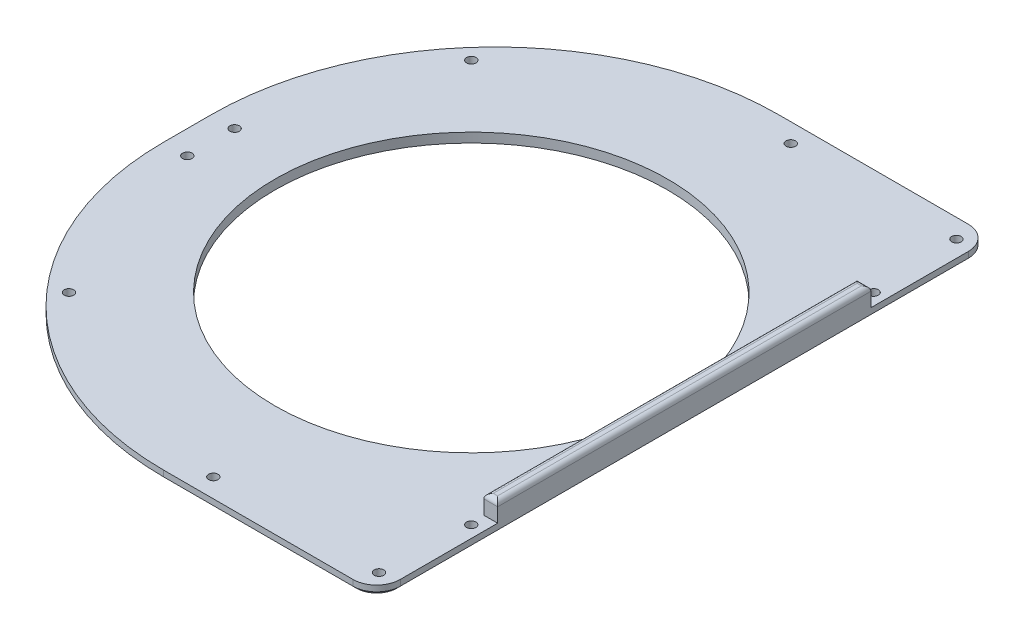
ISO-10303-21;
HEADER;
FILE_DESCRIPTION(('STEP AP214'),'2;1');
FILE_NAME('part.step','',(''),(''),'','','');
FILE_SCHEMA(('AUTOMOTIVE_DESIGN { 1 0 10303 214 1 1 1 1 }'));
ENDSEC;
DATA;
#1=APPLICATION_CONTEXT('core data for automotive mechanical design processes');
#2=APPLICATION_PROTOCOL_DEFINITION('international standard','automotive_design',2000,#1);
#3=PRODUCT_CONTEXT('',#1,'mechanical');
#4=PRODUCT('Part','Part','',(#3));
#5=PRODUCT_RELATED_PRODUCT_CATEGORY('part','',(#4));
#6=PRODUCT_DEFINITION_FORMATION('','',#4);
#7=PRODUCT_DEFINITION_CONTEXT('part definition',#1,'design');
#8=PRODUCT_DEFINITION('design','',#6,#7);
#9=PRODUCT_DEFINITION_SHAPE('','',#8);
#10=(LENGTH_UNIT() NAMED_UNIT(*) SI_UNIT(.MILLI.,.METRE.));
#11=(NAMED_UNIT(*) PLANE_ANGLE_UNIT() SI_UNIT($,.RADIAN.));
#12=(NAMED_UNIT(*) SI_UNIT($,.STERADIAN.) SOLID_ANGLE_UNIT());
#13=UNCERTAINTY_MEASURE_WITH_UNIT(LENGTH_MEASURE(1.E-05),#10,'distance_accuracy_value','');
#14=(GEOMETRIC_REPRESENTATION_CONTEXT(3) GLOBAL_UNCERTAINTY_ASSIGNED_CONTEXT((#13)) GLOBAL_UNIT_ASSIGNED_CONTEXT((#10,
#11,#12)) REPRESENTATION_CONTEXT('',''));
#15=CARTESIAN_POINT('',(0.,0.,0.));
#16=DIRECTION('',(0.,0.,1.));
#17=DIRECTION('',(1.,0.,0.));
#18=AXIS2_PLACEMENT_3D('',#15,#16,#17);
#19=CARTESIAN_POINT('',(0.,4.,0.));
#20=DIRECTION('',(0.,-1.,0.));
#21=DIRECTION('',(0.,0.,-1.));
#22=AXIS2_PLACEMENT_3D('',#19,#20,#21);
#23=PLANE('',#22);
#24=CARTESIAN_POINT('',(83.,4.,-122.));
#25=DIRECTION('',(0.,1.,0.));
#26=DIRECTION('',(0.,0.,1.));
#27=AXIS2_PLACEMENT_3D('',#24,#25,#26);
#28=CIRCLE('',#27,2.);
#29=CARTESIAN_POINT('',(83.,4.,-120.));
#30=VERTEX_POINT('',#29);
#31=EDGE_CURVE('E283',#30,#30,#28,.T.);
#32=ORIENTED_EDGE('',*,*,#31,.F.);
#33=EDGE_LOOP('',(#32));
#34=FACE_BOUND('',#33,.T.);
#35=CARTESIAN_POINT('',(85.,4.,85.));
#36=DIRECTION('',(0.,1.,0.));
#37=DIRECTION('',(0.,0.,1.));
#38=AXIS2_PLACEMENT_3D('',#35,#36,#37);
#39=CIRCLE('',#38,2.);
#40=CARTESIAN_POINT('',(85.,4.,87.));
#41=VERTEX_POINT('',#40);
#42=EDGE_CURVE('E221',#41,#41,#39,.T.);
#43=ORIENTED_EDGE('',*,*,#42,.F.);
#44=EDGE_LOOP('',(#43));
#45=FACE_BOUND('',#44,.T.);
#46=CARTESIAN_POINT('',(-110.,4.,-10.));
#47=DIRECTION('',(0.,1.,0.));
#48=DIRECTION('',(0.,0.,1.));
#49=AXIS2_PLACEMENT_3D('',#46,#47,#48);
#50=CIRCLE('',#49,2.);
#51=CARTESIAN_POINT('',(-110.,4.,-8.));
#52=VERTEX_POINT('',#51);
#53=EDGE_CURVE('E251',#52,#52,#50,.T.);
#54=ORIENTED_EDGE('',*,*,#53,.F.);
#55=EDGE_LOOP('',(#54));
#56=FACE_BOUND('',#55,.T.);
#57=CARTESIAN_POINT('',(13.,4.,122.));
#58=DIRECTION('',(0.,1.,0.));
#59=DIRECTION('',(0.,0.,-1.));
#60=AXIS2_PLACEMENT_3D('',#57,#58,#59);
#61=CIRCLE('',#60,2.);
#62=CARTESIAN_POINT('',(13.,4.,120.));
#63=VERTEX_POINT('',#62);
#64=EDGE_CURVE('E268',#63,#63,#61,.T.);
#65=ORIENTED_EDGE('',*,*,#64,.F.);
#66=EDGE_LOOP('',(#65));
#67=FACE_BOUND('',#66,.T.);
#68=CARTESIAN_POINT('',(83.,4.,122.));
#69=DIRECTION('',(0.,1.,0.));
#70=DIRECTION('',(0.,0.,-1.));
#71=AXIS2_PLACEMENT_3D('',#68,#69,#70);
#72=CIRCLE('',#71,2.);
#73=CARTESIAN_POINT('',(83.,4.,120.));
#74=VERTEX_POINT('',#73);
#75=EDGE_CURVE('E267',#74,#74,#72,.T.);
#76=ORIENTED_EDGE('',*,*,#75,.F.);
#77=EDGE_LOOP('',(#76));
#78=FACE_BOUND('',#77,.T.);
#79=CARTESIAN_POINT('',(13.,4.,-122.));
#80=DIRECTION('',(0.,1.,0.));
#81=DIRECTION('',(0.,0.,1.));
#82=AXIS2_PLACEMENT_3D('',#79,#80,#81);
#83=CIRCLE('',#82,2.);
#84=CARTESIAN_POINT('',(13.,4.,-120.));
#85=VERTEX_POINT('',#84);
#86=EDGE_CURVE('E284',#85,#85,#83,.T.);
#87=ORIENTED_EDGE('',*,*,#86,.F.);
#88=EDGE_LOOP('',(#87));
#89=FACE_BOUND('',#88,.T.);
#90=CARTESIAN_POINT('',(-85.,4.,85.));
#91=DIRECTION('',(0.,1.,0.));
#92=DIRECTION('',(0.,0.,1.));
#93=AXIS2_PLACEMENT_3D('',#90,#91,#92);
#94=CIRCLE('',#93,2.);
#95=CARTESIAN_POINT('',(-85.,4.,87.));
#96=VERTEX_POINT('',#95);
#97=EDGE_CURVE('E227',#96,#96,#94,.T.);
#98=ORIENTED_EDGE('',*,*,#97,.F.);
#99=EDGE_LOOP('',(#98));
#100=FACE_BOUND('',#99,.T.);
#101=CARTESIAN_POINT('',(85.,4.,-85.));
#102=DIRECTION('',(0.,1.,0.));
#103=DIRECTION('',(0.,0.,1.));
#104=AXIS2_PLACEMENT_3D('',#101,#102,#103);
#105=CIRCLE('',#104,2.);
#106=CARTESIAN_POINT('',(85.,4.,-83.));
#107=VERTEX_POINT('',#106);
#108=EDGE_CURVE('E236',#107,#107,#105,.T.);
#109=ORIENTED_EDGE('',*,*,#108,.F.);
#110=EDGE_LOOP('',(#109));
#111=FACE_BOUND('',#110,.T.);
#112=CARTESIAN_POINT('',(-85.,4.,-85.));
#113=DIRECTION('',(0.,1.,0.));
#114=DIRECTION('',(0.,0.,1.));
#115=AXIS2_PLACEMENT_3D('',#112,#113,#114);
#116=CIRCLE('',#115,2.);
#117=CARTESIAN_POINT('',(-85.,4.,-83.));
#118=VERTEX_POINT('',#117);
#119=EDGE_CURVE('E235',#118,#118,#116,.T.);
#120=ORIENTED_EDGE('',*,*,#119,.F.);
#121=EDGE_LOOP('',(#120));
#122=FACE_BOUND('',#121,.T.);
#123=CARTESIAN_POINT('',(-110.,4.,10.));
#124=DIRECTION('',(0.,1.,0.));
#125=DIRECTION('',(0.,0.,1.));
#126=AXIS2_PLACEMENT_3D('',#123,#124,#125);
#127=CIRCLE('',#126,2.);
#128=CARTESIAN_POINT('',(-110.,4.,12.));
#129=VERTEX_POINT('',#128);
#130=EDGE_CURVE('E252',#129,#129,#127,.T.);
#131=ORIENTED_EDGE('',*,*,#130,.F.);
#132=EDGE_LOOP('',(#131));
#133=FACE_BOUND('',#132,.T.);
#134=CARTESIAN_POINT('',(0.,4.,0.));
#135=DIRECTION('',(0.,1.,0.));
#136=DIRECTION('',(0.,0.,1.));
#137=AXIS2_PLACEMENT_3D('',#134,#135,#136);
#138=CIRCLE('',#137,83.);
#139=CARTESIAN_POINT('',(0.,4.,83.));
#140=VERTEX_POINT('',#139);
#141=EDGE_CURVE('E213',#140,#140,#138,.T.);
#142=ORIENTED_EDGE('',*,*,#141,.F.);
#143=EDGE_LOOP('',(#142));
#144=FACE_BOUND('',#143,.T.);
#145=DIRECTION('',(1.,0.,0.));
#146=VECTOR('',#145,1.);
#147=CARTESIAN_POINT('',(84.157247853746,4.,78.8649064876973));
#148=LINE('',#147,#146);
#149=CARTESIAN_POINT('',(84.157247853746,4.,78.8649064876973));
#150=VERTEX_POINT('',#149);
#151=CARTESIAN_POINT('',(90.,4.,78.8649064876973));
#152=VERTEX_POINT('',#151);
#153=EDGE_CURVE('E191',#150,#152,#148,.T.);
#154=ORIENTED_EDGE('',*,*,#153,.F.);
#155=DIRECTION('',(0.,0.,1.));
#156=VECTOR('',#155,1.);
#157=CARTESIAN_POINT('',(84.157247853746,4.,78.8649064876973));
#158=LINE('',#157,#156);
#159=CARTESIAN_POINT('',(84.157247853746,4.,-78.8649064876973));
#160=VERTEX_POINT('',#159);
#161=EDGE_CURVE('E173',#160,#150,#158,.T.);
#162=ORIENTED_EDGE('',*,*,#161,.F.);
#163=DIRECTION('',(-1.,0.,0.));
#164=VECTOR('',#163,1.);
#165=CARTESIAN_POINT('',(84.157247853746,4.,-78.8649064876973));
#166=LINE('',#165,#164);
#167=CARTESIAN_POINT('',(90.,4.,-78.8649064876973));
#168=VERTEX_POINT('',#167);
#169=EDGE_CURVE('E187',#168,#160,#166,.T.);
#170=ORIENTED_EDGE('',*,*,#169,.F.);
#171=DIRECTION('',(0.,0.,1.));
#172=VECTOR('',#171,1.);
#173=CARTESIAN_POINT('',(90.,4.,-130.));
#174=LINE('',#173,#172);
#175=CARTESIAN_POINT('',(90.,4.,-120.));
#176=VERTEX_POINT('',#175);
#177=EDGE_CURVE('E218',#176,#168,#174,.T.);
#178=ORIENTED_EDGE('',*,*,#177,.F.);
#179=CARTESIAN_POINT('',(80.,4.,-120.));
#180=DIRECTION('',(0.,-1.,0.));
#181=DIRECTION('',(0.,0.,-1.));
#182=AXIS2_PLACEMENT_3D('',#179,#180,#181);
#183=CIRCLE('',#182,10.);
#184=CARTESIAN_POINT('',(80.,4.,-130.));
#185=VERTEX_POINT('',#184);
#186=EDGE_CURVE('E324',#176,#185,#183,.F.);
#187=ORIENTED_EDGE('',*,*,#186,.T.);
#188=DIRECTION('',(-1.,0.,0.));
#189=VECTOR('',#188,1.);
#190=CARTESIAN_POINT('',(-120.,4.,-130.));
#191=LINE('',#190,#189);
#192=CARTESIAN_POINT('',(0.,4.,-130.));
#193=VERTEX_POINT('',#192);
#194=EDGE_CURVE('E299',#185,#193,#191,.T.);
#195=ORIENTED_EDGE('',*,*,#194,.T.);
#196=CARTESIAN_POINT('',(0.,4.,-10.));
#197=DIRECTION('',(0.,-1.,0.));
#198=DIRECTION('',(0.,0.,-1.));
#199=AXIS2_PLACEMENT_3D('',#196,#197,#198);
#200=CIRCLE('',#199,120.);
#201=CARTESIAN_POINT('',(-120.,4.,-10.));
#202=VERTEX_POINT('',#201);
#203=EDGE_CURVE('E347',#193,#202,#200,.F.);
#204=ORIENTED_EDGE('',*,*,#203,.T.);
#205=DIRECTION('',(0.,0.,1.));
#206=VECTOR('',#205,1.);
#207=CARTESIAN_POINT('',(-120.,4.,130.));
#208=LINE('',#207,#206);
#209=CARTESIAN_POINT('',(-120.,4.,10.));
#210=VERTEX_POINT('',#209);
#211=EDGE_CURVE('E306',#202,#210,#208,.T.);
#212=ORIENTED_EDGE('',*,*,#211,.T.);
#213=CARTESIAN_POINT('',(0.,4.,10.));
#214=DIRECTION('',(0.,-1.,0.));
#215=DIRECTION('',(0.,0.,-1.));
#216=AXIS2_PLACEMENT_3D('',#213,#214,#215);
#217=CIRCLE('',#216,120.);
#218=CARTESIAN_POINT('',(0.,4.,130.));
#219=VERTEX_POINT('',#218);
#220=EDGE_CURVE('E344',#210,#219,#217,.F.);
#221=ORIENTED_EDGE('',*,*,#220,.T.);
#222=DIRECTION('',(1.,0.,0.));
#223=VECTOR('',#222,1.);
#224=CARTESIAN_POINT('',(-120.,4.,130.));
#225=LINE('',#224,#223);
#226=CARTESIAN_POINT('',(80.,4.,130.));
#227=VERTEX_POINT('',#226);
#228=EDGE_CURVE('E310',#219,#227,#225,.T.);
#229=ORIENTED_EDGE('',*,*,#228,.T.);
#230=CARTESIAN_POINT('',(80.,4.,120.));
#231=DIRECTION('',(0.,-1.,0.));
#232=DIRECTION('',(0.,0.,-1.));
#233=AXIS2_PLACEMENT_3D('',#230,#231,#232);
#234=CIRCLE('',#233,10.);
#235=CARTESIAN_POINT('',(90.,4.,120.));
#236=VERTEX_POINT('',#235);
#237=EDGE_CURVE('E320',#227,#236,#234,.F.);
#238=ORIENTED_EDGE('',*,*,#237,.T.);
#239=EDGE_CURVE('E222',#152,#236,#174,.T.);
#240=ORIENTED_EDGE('',*,*,#239,.F.);
#241=EDGE_LOOP('',(#154,#162,#170,#178,#187,#195,#204,#212,#221,#229,#238,#240));
#242=FACE_BOUND('',#241,.T.);
#243=ADVANCED_FACE('F40',(#34,#45,#56,#67,#78,#89,#100,#111,#122,#133,#144,#242),#23,.F.);
#244=CARTESIAN_POINT('',(-120.,4.,-130.));
#245=DIRECTION('',(0.,0.,1.));
#246=DIRECTION('',(1.,0.,0.));
#247=AXIS2_PLACEMENT_3D('',#244,#245,#246);
#248=PLANE('',#247);
#249=DIRECTION('',(0.,1.,0.));
#250=VECTOR('',#249,1.);
#251=CARTESIAN_POINT('',(80.,4.,-130.));
#252=LINE('',#251,#250);
#253=CARTESIAN_POINT('',(80.,1.5,-130.));
#254=VERTEX_POINT('',#253);
#255=EDGE_CURVE('E327',#185,#254,#252,.F.);
#256=ORIENTED_EDGE('',*,*,#255,.T.);
#257=DIRECTION('',(-1.,0.,0.));
#258=VECTOR('',#257,1.);
#259=CARTESIAN_POINT('',(0.,1.5,-130.));
#260=LINE('',#259,#258);
#261=CARTESIAN_POINT('',(0.,1.5,-130.));
#262=VERTEX_POINT('',#261);
#263=EDGE_CURVE('E429',#254,#262,#260,.T.);
#264=ORIENTED_EDGE('',*,*,#263,.T.);
#265=DIRECTION('',(0.,-1.,0.));
#266=VECTOR('',#265,1.);
#267=CARTESIAN_POINT('',(0.,4.,-130.));
#268=LINE('',#267,#266);
#269=EDGE_CURVE('E341',#262,#193,#268,.F.);
#270=ORIENTED_EDGE('',*,*,#269,.T.);
#271=ORIENTED_EDGE('',*,*,#194,.F.);
#272=EDGE_LOOP('',(#256,#264,#270,#271));
#273=FACE_BOUND('',#272,.T.);
#274=ADVANCED_FACE('F526',(#273),#248,.F.);
#275=CARTESIAN_POINT('',(-120.,4.,130.));
#276=DIRECTION('',(1.,0.,0.));
#277=DIRECTION('',(0.,0.,-1.));
#278=AXIS2_PLACEMENT_3D('',#275,#276,#277);
#279=PLANE('',#278);
#280=DIRECTION('',(0.,-1.,0.));
#281=VECTOR('',#280,1.);
#282=CARTESIAN_POINT('',(-120.,4.,-10.));
#283=LINE('',#282,#281);
#284=CARTESIAN_POINT('',(-120.,1.5,-10.));
#285=VERTEX_POINT('',#284);
#286=EDGE_CURVE('E337',#202,#285,#283,.T.);
#287=ORIENTED_EDGE('',*,*,#286,.T.);
#288=DIRECTION('',(0.,0.,1.));
#289=VECTOR('',#288,1.);
#290=CARTESIAN_POINT('',(-120.,1.5,10.));
#291=LINE('',#290,#289);
#292=CARTESIAN_POINT('',(-120.,1.5,10.));
#293=VERTEX_POINT('',#292);
#294=EDGE_CURVE('E382',#285,#293,#291,.T.);
#295=ORIENTED_EDGE('',*,*,#294,.T.);
#296=DIRECTION('',(0.,-1.,0.));
#297=VECTOR('',#296,1.);
#298=CARTESIAN_POINT('',(-120.,4.,10.));
#299=LINE('',#298,#297);
#300=EDGE_CURVE('E334',#293,#210,#299,.F.);
#301=ORIENTED_EDGE('',*,*,#300,.T.);
#302=ORIENTED_EDGE('',*,*,#211,.F.);
#303=EDGE_LOOP('',(#287,#295,#301,#302));
#304=FACE_BOUND('',#303,.T.);
#305=ADVANCED_FACE('F495',(#304),#279,.F.);
#306=CARTESIAN_POINT('',(-120.,4.,130.));
#307=DIRECTION('',(0.,0.,-1.));
#308=DIRECTION('',(-1.,0.,0.));
#309=AXIS2_PLACEMENT_3D('',#306,#307,#308);
#310=PLANE('',#309);
#311=DIRECTION('',(0.,-1.,0.));
#312=VECTOR('',#311,1.);
#313=CARTESIAN_POINT('',(0.,4.,130.));
#314=LINE('',#313,#312);
#315=CARTESIAN_POINT('',(0.,1.5,130.));
#316=VERTEX_POINT('',#315);
#317=EDGE_CURVE('E350',#219,#316,#314,.T.);
#318=ORIENTED_EDGE('',*,*,#317,.T.);
#319=DIRECTION('',(1.,0.,0.));
#320=VECTOR('',#319,1.);
#321=CARTESIAN_POINT('',(80.,1.5,130.));
#322=LINE('',#321,#320);
#323=CARTESIAN_POINT('',(80.,1.5,130.));
#324=VERTEX_POINT('',#323);
#325=EDGE_CURVE('E426',#316,#324,#322,.T.);
#326=ORIENTED_EDGE('',*,*,#325,.T.);
#327=DIRECTION('',(0.,1.,0.));
#328=VECTOR('',#327,1.);
#329=CARTESIAN_POINT('',(80.,4.,130.));
#330=LINE('',#329,#328);
#331=EDGE_CURVE('E331',#324,#227,#330,.T.);
#332=ORIENTED_EDGE('',*,*,#331,.T.);
#333=ORIENTED_EDGE('',*,*,#228,.F.);
#334=EDGE_LOOP('',(#318,#326,#332,#333));
#335=FACE_BOUND('',#334,.T.);
#336=ADVANCED_FACE('F505',(#335),#310,.F.);
#337=CARTESIAN_POINT('',(0.,0.,0.));
#338=DIRECTION('',(0.,-1.,0.));
#339=DIRECTION('',(0.,0.,-1.));
#340=AXIS2_PLACEMENT_3D('',#337,#338,#339);
#341=PLANE('',#340);
#342=CARTESIAN_POINT('',(0.,0.,10.));
#343=DIRECTION('',(0.,-1.,0.));
#344=DIRECTION('',(0.,0.,-1.));
#345=AXIS2_PLACEMENT_3D('',#342,#343,#344);
#346=CIRCLE('',#345,118.5);
#347=CARTESIAN_POINT('',(0.,0.,128.5));
#348=VERTEX_POINT('',#347);
#349=CARTESIAN_POINT('',(-118.5,0.,10.));
#350=VERTEX_POINT('',#349);
#351=EDGE_CURVE('E413',#348,#350,#346,.T.);
#352=ORIENTED_EDGE('',*,*,#351,.T.);
#353=DIRECTION('',(0.,0.,-1.));
#354=VECTOR('',#353,1.);
#355=CARTESIAN_POINT('',(-118.5,0.,-10.));
#356=LINE('',#355,#354);
#357=CARTESIAN_POINT('',(-118.5,0.,-10.));
#358=VERTEX_POINT('',#357);
#359=EDGE_CURVE('E416',#350,#358,#356,.T.);
#360=ORIENTED_EDGE('',*,*,#359,.T.);
#361=CARTESIAN_POINT('',(0.,0.,-10.));
#362=DIRECTION('',(0.,-1.,0.));
#363=DIRECTION('',(0.,0.,-1.));
#364=AXIS2_PLACEMENT_3D('',#361,#362,#363);
#365=CIRCLE('',#364,118.5);
#366=CARTESIAN_POINT('',(0.,0.,-128.5));
#367=VERTEX_POINT('',#366);
#368=EDGE_CURVE('E410',#358,#367,#365,.T.);
#369=ORIENTED_EDGE('',*,*,#368,.T.);
#370=DIRECTION('',(1.,0.,0.));
#371=VECTOR('',#370,1.);
#372=CARTESIAN_POINT('',(80.,0.,-128.5));
#373=LINE('',#372,#371);
#374=CARTESIAN_POINT('',(80.,0.,-128.5));
#375=VERTEX_POINT('',#374);
#376=EDGE_CURVE('E404',#367,#375,#373,.T.);
#377=ORIENTED_EDGE('',*,*,#376,.T.);
#378=CARTESIAN_POINT('',(80.,0.,-120.));
#379=DIRECTION('',(0.,-1.,0.));
#380=DIRECTION('',(0.,0.,-1.));
#381=AXIS2_PLACEMENT_3D('',#378,#379,#380);
#382=CIRCLE('',#381,8.49999999999997);
#383=CARTESIAN_POINT('',(88.5,0.,-120.));
#384=VERTEX_POINT('',#383);
#385=EDGE_CURVE('E398',#375,#384,#382,.T.);
#386=ORIENTED_EDGE('',*,*,#385,.T.);
#387=DIRECTION('',(0.,0.,1.));
#388=VECTOR('',#387,1.);
#389=CARTESIAN_POINT('',(88.5,0.,120.));
#390=LINE('',#389,#388);
#391=CARTESIAN_POINT('',(88.5,0.,120.));
#392=VERTEX_POINT('',#391);
#393=EDGE_CURVE('E395',#384,#392,#390,.T.);
#394=ORIENTED_EDGE('',*,*,#393,.T.);
#395=CARTESIAN_POINT('',(80.,0.,120.));
#396=DIRECTION('',(0.,-1.,0.));
#397=DIRECTION('',(0.,0.,-1.));
#398=AXIS2_PLACEMENT_3D('',#395,#396,#397);
#399=CIRCLE('',#398,8.49999999999997);
#400=CARTESIAN_POINT('',(80.,0.,128.5));
#401=VERTEX_POINT('',#400);
#402=EDGE_CURVE('E401',#392,#401,#399,.T.);
#403=ORIENTED_EDGE('',*,*,#402,.T.);
#404=DIRECTION('',(-1.,0.,0.));
#405=VECTOR('',#404,1.);
#406=CARTESIAN_POINT('',(0.,0.,128.5));
#407=LINE('',#406,#405);
#408=EDGE_CURVE('E407',#401,#348,#407,.T.);
#409=ORIENTED_EDGE('',*,*,#408,.T.);
#410=EDGE_LOOP('',(#352,#360,#369,#377,#386,#394,#403,#409));
#411=FACE_BOUND('',#410,.T.);
#412=CARTESIAN_POINT('',(0.,0.,0.));
#413=DIRECTION('',(0.,-1.,0.));
#414=DIRECTION('',(0.,0.,-1.));
#415=AXIS2_PLACEMENT_3D('',#412,#413,#414);
#416=CIRCLE('',#415,83.);
#417=CARTESIAN_POINT('',(0.,0.,-83.));
#418=VERTEX_POINT('',#417);
#419=EDGE_CURVE('E217',#418,#418,#416,.T.);
#420=ORIENTED_EDGE('',*,*,#419,.F.);
#421=EDGE_LOOP('',(#420));
#422=FACE_BOUND('',#421,.T.);
#423=CARTESIAN_POINT('',(-110.,0.,10.));
#424=DIRECTION('',(0.,1.,0.));
#425=DIRECTION('',(0.,0.,1.));
#426=AXIS2_PLACEMENT_3D('',#423,#424,#425);
#427=CIRCLE('',#426,2.);
#428=CARTESIAN_POINT('',(-110.,0.,12.));
#429=VERTEX_POINT('',#428);
#430=EDGE_CURVE('E247',#429,#429,#427,.T.);
#431=ORIENTED_EDGE('',*,*,#430,.T.);
#432=EDGE_LOOP('',(#431));
#433=FACE_BOUND('',#432,.T.);
#434=CARTESIAN_POINT('',(-85.,0.,-85.));
#435=DIRECTION('',(0.,1.,0.));
#436=DIRECTION('',(0.,0.,1.));
#437=AXIS2_PLACEMENT_3D('',#434,#435,#436);
#438=CIRCLE('',#437,2.);
#439=CARTESIAN_POINT('',(-85.,0.,-83.));
#440=VERTEX_POINT('',#439);
#441=EDGE_CURVE('E256',#440,#440,#438,.T.);
#442=ORIENTED_EDGE('',*,*,#441,.T.);
#443=EDGE_LOOP('',(#442));
#444=FACE_BOUND('',#443,.T.);
#445=CARTESIAN_POINT('',(85.,0.,-85.));
#446=DIRECTION('',(0.,1.,0.));
#447=DIRECTION('',(0.,0.,1.));
#448=AXIS2_PLACEMENT_3D('',#445,#446,#447);
#449=CIRCLE('',#448,2.);
#450=CARTESIAN_POINT('',(85.,0.,-83.));
#451=VERTEX_POINT('',#450);
#452=EDGE_CURVE('E231',#451,#451,#449,.T.);
#453=ORIENTED_EDGE('',*,*,#452,.T.);
#454=EDGE_LOOP('',(#453));
#455=FACE_BOUND('',#454,.T.);
#456=CARTESIAN_POINT('',(-85.,0.,85.));
#457=DIRECTION('',(0.,1.,0.));
#458=DIRECTION('',(0.,0.,1.));
#459=AXIS2_PLACEMENT_3D('',#456,#457,#458);
#460=CIRCLE('',#459,2.);
#461=CARTESIAN_POINT('',(-85.,0.,87.));
#462=VERTEX_POINT('',#461);
#463=EDGE_CURVE('E240',#462,#462,#460,.T.);
#464=ORIENTED_EDGE('',*,*,#463,.T.);
#465=EDGE_LOOP('',(#464));
#466=FACE_BOUND('',#465,.T.);
#467=CARTESIAN_POINT('',(13.,0.,-122.));
#468=DIRECTION('',(0.,1.,0.));
#469=DIRECTION('',(0.,0.,1.));
#470=AXIS2_PLACEMENT_3D('',#467,#468,#469);
#471=CIRCLE('',#470,2.);
#472=CARTESIAN_POINT('',(13.,0.,-120.));
#473=VERTEX_POINT('',#472);
#474=EDGE_CURVE('E279',#473,#473,#471,.T.);
#475=ORIENTED_EDGE('',*,*,#474,.T.);
#476=EDGE_LOOP('',(#475));
#477=FACE_BOUND('',#476,.T.);
#478=CARTESIAN_POINT('',(83.,0.,122.));
#479=DIRECTION('',(0.,1.,0.));
#480=DIRECTION('',(0.,0.,-1.));
#481=AXIS2_PLACEMENT_3D('',#478,#479,#480);
#482=CIRCLE('',#481,2.);
#483=CARTESIAN_POINT('',(83.,0.,120.));
#484=VERTEX_POINT('',#483);
#485=EDGE_CURVE('E288',#484,#484,#482,.T.);
#486=ORIENTED_EDGE('',*,*,#485,.T.);
#487=EDGE_LOOP('',(#486));
#488=FACE_BOUND('',#487,.T.);
#489=CARTESIAN_POINT('',(13.,0.,122.));
#490=DIRECTION('',(0.,1.,0.));
#491=DIRECTION('',(0.,0.,-1.));
#492=AXIS2_PLACEMENT_3D('',#489,#490,#491);
#493=CIRCLE('',#492,2.);
#494=CARTESIAN_POINT('',(13.,0.,120.));
#495=VERTEX_POINT('',#494);
#496=EDGE_CURVE('E263',#495,#495,#493,.T.);
#497=ORIENTED_EDGE('',*,*,#496,.T.);
#498=EDGE_LOOP('',(#497));
#499=FACE_BOUND('',#498,.T.);
#500=CARTESIAN_POINT('',(-110.,0.,-10.));
#501=DIRECTION('',(0.,1.,0.));
#502=DIRECTION('',(0.,0.,1.));
#503=AXIS2_PLACEMENT_3D('',#500,#501,#502);
#504=CIRCLE('',#503,2.);
#505=CARTESIAN_POINT('',(-110.,0.,-8.));
#506=VERTEX_POINT('',#505);
#507=EDGE_CURVE('E272',#506,#506,#504,.T.);
#508=ORIENTED_EDGE('',*,*,#507,.T.);
#509=EDGE_LOOP('',(#508));
#510=FACE_BOUND('',#509,.T.);
#511=CARTESIAN_POINT('',(85.,0.,85.));
#512=DIRECTION('',(0.,1.,0.));
#513=DIRECTION('',(0.,0.,1.));
#514=AXIS2_PLACEMENT_3D('',#511,#512,#513);
#515=CIRCLE('',#514,2.);
#516=CARTESIAN_POINT('',(85.,0.,87.));
#517=VERTEX_POINT('',#516);
#518=EDGE_CURVE('E223',#517,#517,#515,.T.);
#519=ORIENTED_EDGE('',*,*,#518,.T.);
#520=EDGE_LOOP('',(#519));
#521=FACE_BOUND('',#520,.T.);
#522=CARTESIAN_POINT('',(83.,0.,-122.));
#523=DIRECTION('',(0.,1.,0.));
#524=DIRECTION('',(0.,0.,1.));
#525=AXIS2_PLACEMENT_3D('',#522,#523,#524);
#526=CIRCLE('',#525,2.);
#527=CARTESIAN_POINT('',(83.,0.,-120.));
#528=VERTEX_POINT('',#527);
#529=EDGE_CURVE('E295',#528,#528,#526,.T.);
#530=ORIENTED_EDGE('',*,*,#529,.T.);
#531=EDGE_LOOP('',(#530));
#532=FACE_BOUND('',#531,.T.);
#533=ADVANCED_FACE('F474',(#411,#422,#433,#444,#455,#466,#477,#488,#499,#510,#521,#532),#341,.T.);
#534=CARTESIAN_POINT('',(83.,0.,-122.));
#535=DIRECTION('',(0.,1.,0.));
#536=DIRECTION('',(0.,0.,1.));
#537=AXIS2_PLACEMENT_3D('',#534,#535,#536);
#538=CYLINDRICAL_SURFACE('',#537,2.);
#539=ORIENTED_EDGE('',*,*,#529,.F.);
#540=EDGE_LOOP('',(#539));
#541=FACE_BOUND('',#540,.T.);
#542=ORIENTED_EDGE('',*,*,#31,.T.);
#543=EDGE_LOOP('',(#542));
#544=FACE_BOUND('',#543,.T.);
#545=ADVANCED_FACE('F540',(#541,#544),#538,.F.);
#546=CARTESIAN_POINT('',(85.,0.,85.));
#547=DIRECTION('',(0.,1.,0.));
#548=DIRECTION('',(0.,0.,1.));
#549=AXIS2_PLACEMENT_3D('',#546,#547,#548);
#550=CYLINDRICAL_SURFACE('',#549,2.);
#551=ORIENTED_EDGE('',*,*,#518,.F.);
#552=EDGE_LOOP('',(#551));
#553=FACE_BOUND('',#552,.T.);
#554=ORIENTED_EDGE('',*,*,#42,.T.);
#555=EDGE_LOOP('',(#554));
#556=FACE_BOUND('',#555,.T.);
#557=ADVANCED_FACE('F609',(#553,#556),#550,.F.);
#558=CARTESIAN_POINT('',(-110.,0.,-10.));
#559=DIRECTION('',(0.,1.,0.));
#560=DIRECTION('',(0.,0.,1.));
#561=AXIS2_PLACEMENT_3D('',#558,#559,#560);
#562=CYLINDRICAL_SURFACE('',#561,2.);
#563=ORIENTED_EDGE('',*,*,#507,.F.);
#564=EDGE_LOOP('',(#563));
#565=FACE_BOUND('',#564,.T.);
#566=ORIENTED_EDGE('',*,*,#53,.T.);
#567=EDGE_LOOP('',(#566));
#568=FACE_BOUND('',#567,.T.);
#569=ADVANCED_FACE('F612',(#565,#568),#562,.F.);
#570=CARTESIAN_POINT('',(13.,0.,122.));
#571=DIRECTION('',(0.,1.,0.));
#572=DIRECTION('',(0.,0.,1.));
#573=AXIS2_PLACEMENT_3D('',#570,#571,#572);
#574=CYLINDRICAL_SURFACE('',#573,2.);
#575=ORIENTED_EDGE('',*,*,#496,.F.);
#576=EDGE_LOOP('',(#575));
#577=FACE_BOUND('',#576,.T.);
#578=ORIENTED_EDGE('',*,*,#64,.T.);
#579=EDGE_LOOP('',(#578));
#580=FACE_BOUND('',#579,.T.);
#581=ADVANCED_FACE('F630',(#577,#580),#574,.F.);
#582=CARTESIAN_POINT('',(83.,0.,122.));
#583=DIRECTION('',(0.,1.,0.));
#584=DIRECTION('',(0.,0.,1.));
#585=AXIS2_PLACEMENT_3D('',#582,#583,#584);
#586=CYLINDRICAL_SURFACE('',#585,2.);
#587=ORIENTED_EDGE('',*,*,#485,.F.);
#588=EDGE_LOOP('',(#587));
#589=FACE_BOUND('',#588,.T.);
#590=ORIENTED_EDGE('',*,*,#75,.T.);
#591=EDGE_LOOP('',(#590));
#592=FACE_BOUND('',#591,.T.);
#593=ADVANCED_FACE('F633',(#589,#592),#586,.F.);
#594=CARTESIAN_POINT('',(13.,0.,-122.));
#595=DIRECTION('',(0.,1.,0.));
#596=DIRECTION('',(0.,0.,1.));
#597=AXIS2_PLACEMENT_3D('',#594,#595,#596);
#598=CYLINDRICAL_SURFACE('',#597,2.);
#599=ORIENTED_EDGE('',*,*,#474,.F.);
#600=EDGE_LOOP('',(#599));
#601=FACE_BOUND('',#600,.T.);
#602=ORIENTED_EDGE('',*,*,#86,.T.);
#603=EDGE_LOOP('',(#602));
#604=FACE_BOUND('',#603,.T.);
#605=ADVANCED_FACE('F622',(#601,#604),#598,.F.);
#606=CARTESIAN_POINT('',(-85.,0.,85.));
#607=DIRECTION('',(0.,1.,0.));
#608=DIRECTION('',(0.,0.,1.));
#609=AXIS2_PLACEMENT_3D('',#606,#607,#608);
#610=CYLINDRICAL_SURFACE('',#609,2.);
#611=ORIENTED_EDGE('',*,*,#463,.F.);
#612=EDGE_LOOP('',(#611));
#613=FACE_BOUND('',#612,.T.);
#614=ORIENTED_EDGE('',*,*,#97,.T.);
#615=EDGE_LOOP('',(#614));
#616=FACE_BOUND('',#615,.T.);
#617=ADVANCED_FACE('F618',(#613,#616),#610,.F.);
#618=CARTESIAN_POINT('',(85.,0.,-85.));
#619=DIRECTION('',(0.,1.,0.));
#620=DIRECTION('',(0.,0.,1.));
#621=AXIS2_PLACEMENT_3D('',#618,#619,#620);
#622=CYLINDRICAL_SURFACE('',#621,2.);
#623=ORIENTED_EDGE('',*,*,#452,.F.);
#624=EDGE_LOOP('',(#623));
#625=FACE_BOUND('',#624,.T.);
#626=ORIENTED_EDGE('',*,*,#108,.T.);
#627=EDGE_LOOP('',(#626));
#628=FACE_BOUND('',#627,.T.);
#629=ADVANCED_FACE('F614',(#625,#628),#622,.F.);
#630=CARTESIAN_POINT('',(-85.,0.,-85.));
#631=DIRECTION('',(0.,1.,0.));
#632=DIRECTION('',(0.,0.,1.));
#633=AXIS2_PLACEMENT_3D('',#630,#631,#632);
#634=CYLINDRICAL_SURFACE('',#633,2.);
#635=ORIENTED_EDGE('',*,*,#441,.F.);
#636=EDGE_LOOP('',(#635));
#637=FACE_BOUND('',#636,.T.);
#638=ORIENTED_EDGE('',*,*,#119,.T.);
#639=EDGE_LOOP('',(#638));
#640=FACE_BOUND('',#639,.T.);
#641=ADVANCED_FACE('F617',(#637,#640),#634,.F.);
#642=CARTESIAN_POINT('',(-110.,0.,10.));
#643=DIRECTION('',(0.,1.,0.));
#644=DIRECTION('',(0.,0.,1.));
#645=AXIS2_PLACEMENT_3D('',#642,#643,#644);
#646=CYLINDRICAL_SURFACE('',#645,2.);
#647=ORIENTED_EDGE('',*,*,#430,.F.);
#648=EDGE_LOOP('',(#647));
#649=FACE_BOUND('',#648,.T.);
#650=ORIENTED_EDGE('',*,*,#130,.T.);
#651=EDGE_LOOP('',(#650));
#652=FACE_BOUND('',#651,.T.);
#653=ADVANCED_FACE('F608',(#649,#652),#646,.F.);
#654=CARTESIAN_POINT('',(90.,-2.,-130.));
#655=DIRECTION('',(-1.,0.,0.));
#656=DIRECTION('',(0.,0.,1.));
#657=AXIS2_PLACEMENT_3D('',#654,#655,#656);
#658=PLANE('',#657);
#659=DIRECTION('',(0.,1.,0.));
#660=VECTOR('',#659,1.);
#661=CARTESIAN_POINT('',(90.,-2.,120.));
#662=LINE('',#661,#660);
#663=CARTESIAN_POINT('',(90.,1.5,120.));
#664=VERTEX_POINT('',#663);
#665=EDGE_CURVE('E314',#236,#664,#662,.F.);
#666=ORIENTED_EDGE('',*,*,#665,.T.);
#667=DIRECTION('',(0.,0.,-1.));
#668=VECTOR('',#667,1.);
#669=CARTESIAN_POINT('',(90.,1.5,-120.));
#670=LINE('',#669,#668);
#671=CARTESIAN_POINT('',(90.,1.5,-120.));
#672=VERTEX_POINT('',#671);
#673=EDGE_CURVE('E11',#664,#672,#670,.T.);
#674=ORIENTED_EDGE('',*,*,#673,.T.);
#675=DIRECTION('',(0.,1.,0.));
#676=VECTOR('',#675,1.);
#677=CARTESIAN_POINT('',(90.,-2.,-120.));
#678=LINE('',#677,#676);
#679=EDGE_CURVE('E317',#672,#176,#678,.T.);
#680=ORIENTED_EDGE('',*,*,#679,.T.);
#681=ORIENTED_EDGE('',*,*,#177,.T.);
#682=DIRECTION('',(0.,-1.,0.));
#683=VECTOR('',#682,1.);
#684=CARTESIAN_POINT('',(90.,12.,-78.8649064876973));
#685=LINE('',#684,#683);
#686=CARTESIAN_POINT('',(90.,10.,-78.8649064876973));
#687=VERTEX_POINT('',#686);
#688=EDGE_CURVE('E180',#687,#168,#685,.T.);
#689=ORIENTED_EDGE('',*,*,#688,.F.);
#690=DIRECTION('',(0.,0.,-1.));
#691=VECTOR('',#690,1.);
#692=CARTESIAN_POINT('',(90.,10.,-130.));
#693=LINE('',#692,#691);
#694=CARTESIAN_POINT('',(90.,10.,78.8649064876973));
#695=VERTEX_POINT('',#694);
#696=EDGE_CURVE('E379',#687,#695,#693,.F.);
#697=ORIENTED_EDGE('',*,*,#696,.T.);
#698=DIRECTION('',(0.,-1.,0.));
#699=VECTOR('',#698,1.);
#700=CARTESIAN_POINT('',(90.,12.,78.8649064876973));
#701=LINE('',#700,#699);
#702=EDGE_CURVE('E206',#695,#152,#701,.T.);
#703=ORIENTED_EDGE('',*,*,#702,.T.);
#704=ORIENTED_EDGE('',*,*,#239,.T.);
#705=EDGE_LOOP('',(#666,#674,#680,#681,#689,#697,#703,#704));
#706=FACE_BOUND('',#705,.T.);
#707=ADVANCED_FACE('F552',(#706),#658,.F.);
#708=CARTESIAN_POINT('',(80.,-2.,-120.));
#709=DIRECTION('',(0.,1.,0.));
#710=DIRECTION('',(0.,0.,1.));
#711=AXIS2_PLACEMENT_3D('',#708,#709,#710);
#712=CYLINDRICAL_SURFACE('',#711,10.);
#713=ORIENTED_EDGE('',*,*,#679,.F.);
#714=CARTESIAN_POINT('',(80.,1.5,-120.));
#715=DIRECTION('',(0.,-1.,0.));
#716=DIRECTION('',(0.,0.,-1.));
#717=AXIS2_PLACEMENT_3D('',#714,#715,#716);
#718=CIRCLE('',#717,10.);
#719=EDGE_CURVE('E51',#672,#254,#718,.F.);
#720=ORIENTED_EDGE('',*,*,#719,.T.);
#721=ORIENTED_EDGE('',*,*,#255,.F.);
#722=ORIENTED_EDGE('',*,*,#186,.F.);
#723=EDGE_LOOP('',(#713,#720,#721,#722));
#724=FACE_BOUND('',#723,.T.);
#725=ADVANCED_FACE('F548',(#724),#712,.T.);
#726=CARTESIAN_POINT('',(80.,4.,120.));
#727=DIRECTION('',(0.,1.,0.));
#728=DIRECTION('',(0.,0.,1.));
#729=AXIS2_PLACEMENT_3D('',#726,#727,#728);
#730=CYLINDRICAL_SURFACE('',#729,10.);
#731=ORIENTED_EDGE('',*,*,#331,.F.);
#732=CARTESIAN_POINT('',(80.,1.5,120.));
#733=DIRECTION('',(0.,-1.,0.));
#734=DIRECTION('',(0.,0.,-1.));
#735=AXIS2_PLACEMENT_3D('',#732,#733,#734);
#736=CIRCLE('',#735,10.);
#737=EDGE_CURVE('E65',#324,#664,#736,.F.);
#738=ORIENTED_EDGE('',*,*,#737,.T.);
#739=ORIENTED_EDGE('',*,*,#665,.F.);
#740=ORIENTED_EDGE('',*,*,#237,.F.);
#741=EDGE_LOOP('',(#731,#738,#739,#740));
#742=FACE_BOUND('',#741,.T.);
#743=ADVANCED_FACE('F551',(#742),#730,.T.);
#744=CARTESIAN_POINT('',(0.,4.,-10.));
#745=DIRECTION('',(0.,-1.,0.));
#746=DIRECTION('',(0.,0.,-1.));
#747=AXIS2_PLACEMENT_3D('',#744,#745,#746);
#748=CYLINDRICAL_SURFACE('',#747,120.);
#749=ORIENTED_EDGE('',*,*,#269,.F.);
#750=CARTESIAN_POINT('',(0.,1.5,-10.));
#751=DIRECTION('',(0.,-1.,0.));
#752=DIRECTION('',(0.,0.,-1.));
#753=AXIS2_PLACEMENT_3D('',#750,#751,#752);
#754=CIRCLE('',#753,120.);
#755=EDGE_CURVE('E423',#262,#285,#754,.F.);
#756=ORIENTED_EDGE('',*,*,#755,.T.);
#757=ORIENTED_EDGE('',*,*,#286,.F.);
#758=ORIENTED_EDGE('',*,*,#203,.F.);
#759=EDGE_LOOP('',(#749,#756,#757,#758));
#760=FACE_BOUND('',#759,.T.);
#761=ADVANCED_FACE('F491',(#760),#748,.T.);
#762=CARTESIAN_POINT('',(0.,4.,10.));
#763=DIRECTION('',(0.,-1.,0.));
#764=DIRECTION('',(0.,0.,-1.));
#765=AXIS2_PLACEMENT_3D('',#762,#763,#764);
#766=CYLINDRICAL_SURFACE('',#765,120.);
#767=ORIENTED_EDGE('',*,*,#300,.F.);
#768=CARTESIAN_POINT('',(0.,1.5,10.));
#769=DIRECTION('',(0.,-1.,0.));
#770=DIRECTION('',(0.,0.,-1.));
#771=AXIS2_PLACEMENT_3D('',#768,#769,#770);
#772=CIRCLE('',#771,120.);
#773=EDGE_CURVE('E420',#293,#316,#772,.F.);
#774=ORIENTED_EDGE('',*,*,#773,.T.);
#775=ORIENTED_EDGE('',*,*,#317,.F.);
#776=ORIENTED_EDGE('',*,*,#220,.F.);
#777=EDGE_LOOP('',(#767,#774,#775,#776));
#778=FACE_BOUND('',#777,.T.);
#779=ADVANCED_FACE('F501',(#778),#766,.T.);
#780=CARTESIAN_POINT('',(0.,-2.,0.));
#781=DIRECTION('',(0.,1.,0.));
#782=DIRECTION('',(0.,0.,1.));
#783=AXIS2_PLACEMENT_3D('',#780,#781,#782);
#784=CYLINDRICAL_SURFACE('',#783,83.);
#785=ORIENTED_EDGE('',*,*,#419,.T.);
#786=EDGE_LOOP('',(#785));
#787=FACE_BOUND('',#786,.T.);
#788=ORIENTED_EDGE('',*,*,#141,.T.);
#789=EDGE_LOOP('',(#788));
#790=FACE_BOUND('',#789,.T.);
#791=ADVANCED_FACE('F560',(#787,#790),#784,.F.);
#792=CARTESIAN_POINT('',(84.157247853746,12.,-78.8649064876973));
#793=DIRECTION('',(0.,0.,1.));
#794=DIRECTION('',(1.,0.,0.));
#795=AXIS2_PLACEMENT_3D('',#792,#793,#794);
#796=PLANE('',#795);
#797=DIRECTION('',(0.,-1.,0.));
#798=VECTOR('',#797,1.);
#799=CARTESIAN_POINT('',(84.157247853746,12.,-78.8649064876973));
#800=LINE('',#799,#798);
#801=CARTESIAN_POINT('',(84.157247853746,10.,-78.8649064876973));
#802=VERTEX_POINT('',#801);
#803=EDGE_CURVE('E169',#802,#160,#800,.T.);
#804=ORIENTED_EDGE('',*,*,#803,.F.);
#805=DIRECTION('',(-1.,0.,0.));
#806=VECTOR('',#805,1.);
#807=CARTESIAN_POINT('',(84.157247853746,10.,-78.8649064876973));
#808=LINE('',#807,#806);
#809=EDGE_CURVE('E376',#802,#687,#808,.F.);
#810=ORIENTED_EDGE('',*,*,#809,.T.);
#811=ORIENTED_EDGE('',*,*,#688,.T.);
#812=ORIENTED_EDGE('',*,*,#169,.T.);
#813=EDGE_LOOP('',(#804,#810,#811,#812));
#814=FACE_BOUND('',#813,.T.);
#815=ADVANCED_FACE('F194',(#814),#796,.F.);
#816=CARTESIAN_POINT('',(84.157247853746,12.,78.8649064876973));
#817=DIRECTION('',(1.,0.,0.));
#818=DIRECTION('',(0.,0.,-1.));
#819=AXIS2_PLACEMENT_3D('',#816,#817,#818);
#820=PLANE('',#819);
#821=DIRECTION('',(0.,-1.,0.));
#822=VECTOR('',#821,1.);
#823=CARTESIAN_POINT('',(84.157247853746,12.,78.8649064876973));
#824=LINE('',#823,#822);
#825=CARTESIAN_POINT('',(84.157247853746,10.,78.8649064876973));
#826=VERTEX_POINT('',#825);
#827=EDGE_CURVE('E181',#826,#150,#824,.T.);
#828=ORIENTED_EDGE('',*,*,#827,.F.);
#829=DIRECTION('',(0.,0.,1.));
#830=VECTOR('',#829,1.);
#831=CARTESIAN_POINT('',(84.157247853746,10.,78.8649064876973));
#832=LINE('',#831,#830);
#833=EDGE_CURVE('E175',#826,#802,#832,.F.);
#834=ORIENTED_EDGE('',*,*,#833,.T.);
#835=ORIENTED_EDGE('',*,*,#803,.T.);
#836=ORIENTED_EDGE('',*,*,#161,.T.);
#837=EDGE_LOOP('',(#828,#834,#835,#836));
#838=FACE_BOUND('',#837,.T.);
#839=ADVANCED_FACE('F172',(#838),#820,.F.);
#840=CARTESIAN_POINT('',(84.157247853746,12.,78.8649064876973));
#841=DIRECTION('',(0.,0.,-1.));
#842=DIRECTION('',(-1.,0.,0.));
#843=AXIS2_PLACEMENT_3D('',#840,#841,#842);
#844=PLANE('',#843);
#845=ORIENTED_EDGE('',*,*,#702,.F.);
#846=DIRECTION('',(1.,0.,0.));
#847=VECTOR('',#846,1.);
#848=CARTESIAN_POINT('',(84.157247853746,10.,78.8649064876973));
#849=LINE('',#848,#847);
#850=EDGE_CURVE('E370',#695,#826,#849,.F.);
#851=ORIENTED_EDGE('',*,*,#850,.T.);
#852=ORIENTED_EDGE('',*,*,#827,.T.);
#853=ORIENTED_EDGE('',*,*,#153,.T.);
#854=EDGE_LOOP('',(#845,#851,#852,#853));
#855=FACE_BOUND('',#854,.T.);
#856=ADVANCED_FACE('F579',(#855),#844,.F.);
#857=CARTESIAN_POINT('',(0.,12.,0.));
#858=DIRECTION('',(0.,-1.,0.));
#859=DIRECTION('',(0.,0.,-1.));
#860=AXIS2_PLACEMENT_3D('',#857,#858,#859);
#861=PLANE('',#860);
#862=DIRECTION('',(0.,0.,1.));
#863=VECTOR('',#862,1.);
#864=CARTESIAN_POINT('',(86.157247853746,12.,0.));
#865=LINE('',#864,#863);
#866=CARTESIAN_POINT('',(86.157247853746,12.,-76.8649064876973));
#867=VERTEX_POINT('',#866);
#868=CARTESIAN_POINT('',(86.157247853746,12.,76.8649064876973));
#869=VERTEX_POINT('',#868);
#870=EDGE_CURVE('E363',#867,#869,#865,.T.);
#871=ORIENTED_EDGE('',*,*,#870,.T.);
#872=DIRECTION('',(1.,0.,0.));
#873=VECTOR('',#872,1.);
#874=CARTESIAN_POINT('',(0.,12.,76.8649064876973));
#875=LINE('',#874,#873);
#876=CARTESIAN_POINT('',(88.,12.,76.8649064876973));
#877=VERTEX_POINT('',#876);
#878=EDGE_CURVE('E366',#869,#877,#875,.T.);
#879=ORIENTED_EDGE('',*,*,#878,.T.);
#880=DIRECTION('',(0.,0.,-1.));
#881=VECTOR('',#880,1.);
#882=CARTESIAN_POINT('',(88.,12.,0.));
#883=LINE('',#882,#881);
#884=CARTESIAN_POINT('',(88.,12.,-76.8649064876973));
#885=VERTEX_POINT('',#884);
#886=EDGE_CURVE('E354',#877,#885,#883,.T.);
#887=ORIENTED_EDGE('',*,*,#886,.T.);
#888=DIRECTION('',(-1.,0.,0.));
#889=VECTOR('',#888,1.);
#890=CARTESIAN_POINT('',(0.,12.,-76.8649064876973));
#891=LINE('',#890,#889);
#892=EDGE_CURVE('E360',#885,#867,#891,.T.);
#893=ORIENTED_EDGE('',*,*,#892,.T.);
#894=EDGE_LOOP('',(#871,#879,#887,#893));
#895=FACE_BOUND('',#894,.T.);
#896=ADVANCED_FACE('F574',(#895),#861,.F.);
#897=CARTESIAN_POINT('',(0.,10.,-76.8649064876973));
#898=DIRECTION('',(-1.,0.,0.));
#899=DIRECTION('',(0.,0.,1.));
#900=AXIS2_PLACEMENT_3D('',#897,#898,#899);
#901=CYLINDRICAL_SURFACE('',#900,2.);
#902=CARTESIAN_POINT('',(88.,10.,-76.8649064876973));
#903=DIRECTION('',(-0.707106781186547,0.,-0.707106781186547));
#904=DIRECTION('',(0.707106781186547,0.,-0.707106781186548));
#905=AXIS2_PLACEMENT_3D('',#902,#903,#904);
#906=ELLIPSE('',#905,2.82842712474619,2.);
#907=EDGE_CURVE('E201',#687,#885,#906,.F.);
#908=ORIENTED_EDGE('',*,*,#907,.F.);
#909=ORIENTED_EDGE('',*,*,#809,.F.);
#910=CARTESIAN_POINT('',(86.157247853746,10.,-76.8649064876973));
#911=DIRECTION('',(-0.707106781186547,0.,0.707106781186547));
#912=DIRECTION('',(-0.707106781186547,0.,-0.707106781186547));
#913=AXIS2_PLACEMENT_3D('',#910,#911,#912);
#914=ELLIPSE('',#913,2.82842712474619,2.);
#915=EDGE_CURVE('E197',#867,#802,#914,.T.);
#916=ORIENTED_EDGE('',*,*,#915,.F.);
#917=ORIENTED_EDGE('',*,*,#892,.F.);
#918=EDGE_LOOP('',(#908,#909,#916,#917));
#919=FACE_BOUND('',#918,.T.);
#920=ADVANCED_FACE('F571',(#919),#901,.T.);
#921=CARTESIAN_POINT('',(86.157247853746,10.,0.));
#922=DIRECTION('',(0.,0.,1.));
#923=DIRECTION('',(1.,0.,0.));
#924=AXIS2_PLACEMENT_3D('',#921,#922,#923);
#925=CYLINDRICAL_SURFACE('',#924,2.);
#926=ORIENTED_EDGE('',*,*,#915,.T.);
#927=ORIENTED_EDGE('',*,*,#833,.F.);
#928=CARTESIAN_POINT('',(86.157247853746,10.,76.8649064876973));
#929=DIRECTION('',(0.707106781186547,0.,0.707106781186547));
#930=DIRECTION('',(-0.707106781186547,0.,0.707106781186547));
#931=AXIS2_PLACEMENT_3D('',#928,#929,#930);
#932=ELLIPSE('',#931,2.82842712474619,2.);
#933=EDGE_CURVE('E386',#869,#826,#932,.T.);
#934=ORIENTED_EDGE('',*,*,#933,.F.);
#935=ORIENTED_EDGE('',*,*,#870,.F.);
#936=EDGE_LOOP('',(#926,#927,#934,#935));
#937=FACE_BOUND('',#936,.T.);
#938=ADVANCED_FACE('F568',(#937),#925,.T.);
#939=CARTESIAN_POINT('',(88.,10.,0.));
#940=DIRECTION('',(0.,0.,-1.));
#941=DIRECTION('',(-1.,0.,0.));
#942=AXIS2_PLACEMENT_3D('',#939,#940,#941);
#943=CYLINDRICAL_SURFACE('',#942,2.);
#944=ORIENTED_EDGE('',*,*,#907,.T.);
#945=ORIENTED_EDGE('',*,*,#886,.F.);
#946=CARTESIAN_POINT('',(88.,10.,76.8649064876973));
#947=DIRECTION('',(0.707106781186547,0.,-0.707106781186548));
#948=DIRECTION('',(-0.707106781186547,0.,-0.707106781186547));
#949=AXIS2_PLACEMENT_3D('',#946,#947,#948);
#950=ELLIPSE('',#949,2.82842712474619,2.);
#951=EDGE_CURVE('E383',#695,#877,#950,.F.);
#952=ORIENTED_EDGE('',*,*,#951,.F.);
#953=ORIENTED_EDGE('',*,*,#696,.F.);
#954=EDGE_LOOP('',(#944,#945,#952,#953));
#955=FACE_BOUND('',#954,.T.);
#956=ADVANCED_FACE('F564',(#955),#943,.T.);
#957=CARTESIAN_POINT('',(0.,10.,76.8649064876973));
#958=DIRECTION('',(1.,0.,0.));
#959=DIRECTION('',(0.,0.,-1.));
#960=AXIS2_PLACEMENT_3D('',#957,#958,#959);
#961=CYLINDRICAL_SURFACE('',#960,2.);
#962=ORIENTED_EDGE('',*,*,#933,.T.);
#963=ORIENTED_EDGE('',*,*,#850,.F.);
#964=ORIENTED_EDGE('',*,*,#951,.T.);
#965=ORIENTED_EDGE('',*,*,#878,.F.);
#966=EDGE_LOOP('',(#962,#963,#964,#965));
#967=FACE_BOUND('',#966,.T.);
#968=ADVANCED_FACE('F561',(#967),#961,.T.);
#969=CARTESIAN_POINT('',(90.,1.5,-130.));
#970=DIRECTION('',(0.707106781186541,-0.707106781186554,0.));
#971=DIRECTION('',(0.,0.,1.));
#972=AXIS2_PLACEMENT_3D('',#969,#970,#971);
#973=PLANE('',#972);
#974=DIRECTION('',(0.707106781186554,0.707106781186541,0.));
#975=VECTOR('',#974,1.);
#976=CARTESIAN_POINT('',(88.5,0.,120.));
#977=LINE('',#976,#975);
#978=EDGE_CURVE('E457',#392,#664,#977,.T.);
#979=ORIENTED_EDGE('',*,*,#978,.F.);
#980=ORIENTED_EDGE('',*,*,#393,.F.);
#981=DIRECTION('',(-0.707106781186554,-0.707106781186541,0.));
#982=VECTOR('',#981,1.);
#983=CARTESIAN_POINT('',(90.,1.5,-120.));
#984=LINE('',#983,#982);
#985=EDGE_CURVE('E45',#672,#384,#984,.T.);
#986=ORIENTED_EDGE('',*,*,#985,.F.);
#987=ORIENTED_EDGE('',*,*,#673,.F.);
#988=EDGE_LOOP('',(#979,#980,#986,#987));
#989=FACE_BOUND('',#988,.T.);
#990=ADVANCED_FACE('F43',(#989),#973,.T.);
#991=CARTESIAN_POINT('',(80.,0.,-120.));
#992=DIRECTION('',(0.,1.,0.));
#993=DIRECTION('',(0.,0.,1.));
#994=AXIS2_PLACEMENT_3D('',#991,#992,#993);
#995=CONICAL_SURFACE('',#994,8.49999999999997,0.785398163397459);
#996=ORIENTED_EDGE('',*,*,#985,.T.);
#997=ORIENTED_EDGE('',*,*,#385,.F.);
#998=DIRECTION('',(0.,-0.707106781186541,0.707106781186554));
#999=VECTOR('',#998,1.);
#1000=CARTESIAN_POINT('',(80.,1.5,-130.));
#1001=LINE('',#1000,#999);
#1002=EDGE_CURVE('E454',#254,#375,#1001,.T.);
#1003=ORIENTED_EDGE('',*,*,#1002,.F.);
#1004=ORIENTED_EDGE('',*,*,#719,.F.);
#1005=EDGE_LOOP('',(#996,#997,#1003,#1004));
#1006=FACE_BOUND('',#1005,.T.);
#1007=ADVANCED_FACE('F469',(#1006),#995,.T.);
#1008=CARTESIAN_POINT('',(80.,0.,120.));
#1009=DIRECTION('',(0.,1.,0.));
#1010=DIRECTION('',(0.,0.,1.));
#1011=AXIS2_PLACEMENT_3D('',#1008,#1009,#1010);
#1012=CONICAL_SURFACE('',#1011,8.49999999999997,0.785398163397459);
#1013=ORIENTED_EDGE('',*,*,#978,.T.);
#1014=ORIENTED_EDGE('',*,*,#737,.F.);
#1015=DIRECTION('',(0.,0.707106781186541,0.707106781186554));
#1016=VECTOR('',#1015,1.);
#1017=CARTESIAN_POINT('',(80.,0.,128.5));
#1018=LINE('',#1017,#1016);
#1019=EDGE_CURVE('E450',#401,#324,#1018,.T.);
#1020=ORIENTED_EDGE('',*,*,#1019,.F.);
#1021=ORIENTED_EDGE('',*,*,#402,.F.);
#1022=EDGE_LOOP('',(#1013,#1014,#1020,#1021));
#1023=FACE_BOUND('',#1022,.T.);
#1024=ADVANCED_FACE('F826',(#1023),#1012,.T.);
#1025=CARTESIAN_POINT('',(-120.,1.5,-130.));
#1026=DIRECTION('',(0.,-0.707106781186554,-0.707106781186541));
#1027=DIRECTION('',(1.,0.,0.));
#1028=AXIS2_PLACEMENT_3D('',#1025,#1026,#1027);
#1029=PLANE('',#1028);
#1030=ORIENTED_EDGE('',*,*,#1002,.T.);
#1031=ORIENTED_EDGE('',*,*,#376,.F.);
#1032=DIRECTION('',(0.,-0.707106781186541,0.707106781186554));
#1033=VECTOR('',#1032,1.);
#1034=CARTESIAN_POINT('',(0.,1.5,-130.));
#1035=LINE('',#1034,#1033);
#1036=EDGE_CURVE('E446',#262,#367,#1035,.T.);
#1037=ORIENTED_EDGE('',*,*,#1036,.F.);
#1038=ORIENTED_EDGE('',*,*,#263,.F.);
#1039=EDGE_LOOP('',(#1030,#1031,#1037,#1038));
#1040=FACE_BOUND('',#1039,.T.);
#1041=ADVANCED_FACE('F481',(#1040),#1029,.T.);
#1042=CARTESIAN_POINT('',(-120.,1.5,130.));
#1043=DIRECTION('',(0.,-0.707106781186554,0.707106781186541));
#1044=DIRECTION('',(-1.,0.,0.));
#1045=AXIS2_PLACEMENT_3D('',#1042,#1043,#1044);
#1046=PLANE('',#1045);
#1047=ORIENTED_EDGE('',*,*,#1019,.T.);
#1048=ORIENTED_EDGE('',*,*,#325,.F.);
#1049=DIRECTION('',(0.,0.707106781186541,0.707106781186554));
#1050=VECTOR('',#1049,1.);
#1051=CARTESIAN_POINT('',(0.,0.,128.5));
#1052=LINE('',#1051,#1050);
#1053=EDGE_CURVE('E442',#348,#316,#1052,.T.);
#1054=ORIENTED_EDGE('',*,*,#1053,.F.);
#1055=ORIENTED_EDGE('',*,*,#408,.F.);
#1056=EDGE_LOOP('',(#1047,#1048,#1054,#1055));
#1057=FACE_BOUND('',#1056,.T.);
#1058=ADVANCED_FACE('F508',(#1057),#1046,.T.);
#1059=CARTESIAN_POINT('',(0.,0.,-10.));
#1060=DIRECTION('',(0.,1.,0.));
#1061=DIRECTION('',(0.,0.,1.));
#1062=AXIS2_PLACEMENT_3D('',#1059,#1060,#1061);
#1063=CONICAL_SURFACE('',#1062,118.5,0.785398163397457);
#1064=ORIENTED_EDGE('',*,*,#1036,.T.);
#1065=ORIENTED_EDGE('',*,*,#368,.F.);
#1066=DIRECTION('',(0.707106781186554,-0.707106781186541,0.));
#1067=VECTOR('',#1066,1.);
#1068=CARTESIAN_POINT('',(-120.,1.5,-10.));
#1069=LINE('',#1068,#1067);
#1070=EDGE_CURVE('E439',#285,#358,#1069,.T.);
#1071=ORIENTED_EDGE('',*,*,#1070,.F.);
#1072=ORIENTED_EDGE('',*,*,#755,.F.);
#1073=EDGE_LOOP('',(#1064,#1065,#1071,#1072));
#1074=FACE_BOUND('',#1073,.T.);
#1075=ADVANCED_FACE('F485',(#1074),#1063,.T.);
#1076=CARTESIAN_POINT('',(0.,0.,10.));
#1077=DIRECTION('',(0.,1.,0.));
#1078=DIRECTION('',(0.,0.,1.));
#1079=AXIS2_PLACEMENT_3D('',#1076,#1077,#1078);
#1080=CONICAL_SURFACE('',#1079,118.5,0.785398163397457);
#1081=ORIENTED_EDGE('',*,*,#1053,.T.);
#1082=ORIENTED_EDGE('',*,*,#773,.F.);
#1083=DIRECTION('',(-0.707106781186554,0.707106781186541,0.));
#1084=VECTOR('',#1083,1.);
#1085=CARTESIAN_POINT('',(-118.5,0.,10.));
#1086=LINE('',#1085,#1084);
#1087=EDGE_CURVE('E436',#350,#293,#1086,.T.);
#1088=ORIENTED_EDGE('',*,*,#1087,.F.);
#1089=ORIENTED_EDGE('',*,*,#351,.F.);
#1090=EDGE_LOOP('',(#1081,#1082,#1088,#1089));
#1091=FACE_BOUND('',#1090,.T.);
#1092=ADVANCED_FACE('F512',(#1091),#1080,.T.);
#1093=CARTESIAN_POINT('',(-120.,1.5,130.));
#1094=DIRECTION('',(-0.707106781186541,-0.707106781186554,0.));
#1095=DIRECTION('',(0.,0.,-1.));
#1096=AXIS2_PLACEMENT_3D('',#1093,#1094,#1095);
#1097=PLANE('',#1096);
#1098=ORIENTED_EDGE('',*,*,#1070,.T.);
#1099=ORIENTED_EDGE('',*,*,#359,.F.);
#1100=ORIENTED_EDGE('',*,*,#1087,.T.);
#1101=ORIENTED_EDGE('',*,*,#294,.F.);
#1102=EDGE_LOOP('',(#1098,#1099,#1100,#1101));
#1103=FACE_BOUND('',#1102,.T.);
#1104=ADVANCED_FACE('F516',(#1103),#1097,.T.);
#1105=CLOSED_SHELL('',(#243,#274,#305,#336,#533,#545,#557,#569,#581,#593,#605,#617,#629,#641,
#653,#707,#725,#743,#761,#779,#791,#815,#839,#856,#896,#920,#938,#956,#968,#990,#1007,#1024,
#1041,#1058,#1075,#1092,#1104));
#1106=MANIFOLD_SOLID_BREP('B2',#1105);
#1107=ADVANCED_BREP_SHAPE_REPRESENTATION('',(#18,#1106),#14);
#1108=SHAPE_DEFINITION_REPRESENTATION(#9,#1107);
ENDSEC;
END-ISO-10303-21;
